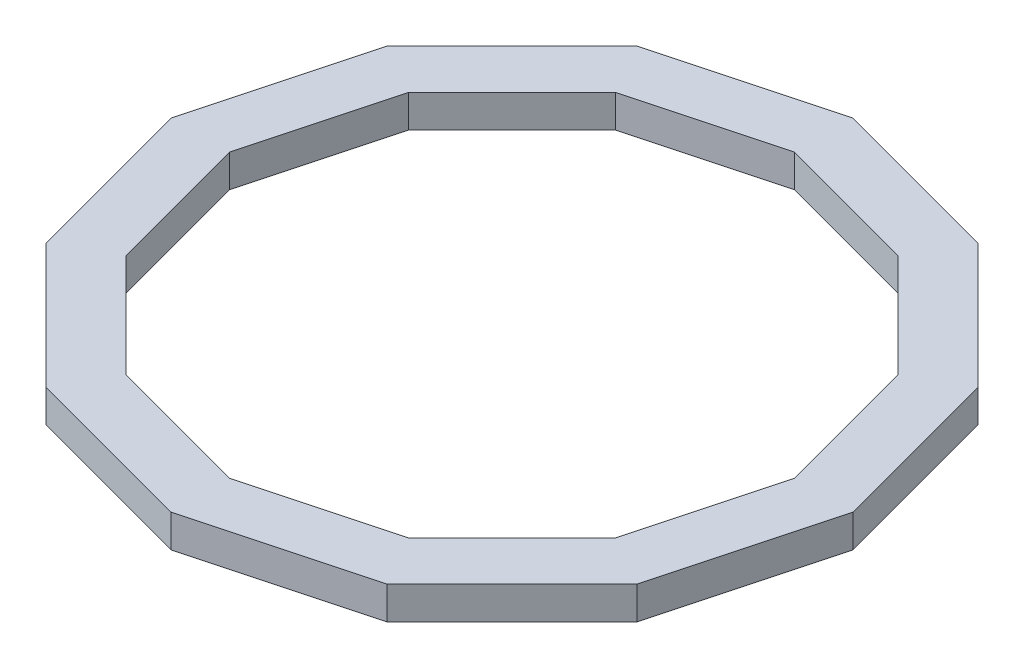
ISO-10303-21;
HEADER;
FILE_DESCRIPTION(('STEP AP214'),'2;1');
FILE_NAME('part.step','',(''),(''),'','','');
FILE_SCHEMA(('AUTOMOTIVE_DESIGN { 1 0 10303 214 1 1 1 1 }'));
ENDSEC;
DATA;
#1=APPLICATION_CONTEXT('core data for automotive mechanical design processes');
#2=APPLICATION_PROTOCOL_DEFINITION('international standard','automotive_design',2000,#1);
#3=PRODUCT_CONTEXT('',#1,'mechanical');
#4=PRODUCT('Part','Part','',(#3));
#5=PRODUCT_RELATED_PRODUCT_CATEGORY('part','',(#4));
#6=PRODUCT_DEFINITION_FORMATION('','',#4);
#7=PRODUCT_DEFINITION_CONTEXT('part definition',#1,'design');
#8=PRODUCT_DEFINITION('design','',#6,#7);
#9=PRODUCT_DEFINITION_SHAPE('','',#8);
#10=(LENGTH_UNIT() NAMED_UNIT(*) SI_UNIT(.MILLI.,.METRE.));
#11=(NAMED_UNIT(*) PLANE_ANGLE_UNIT() SI_UNIT($,.RADIAN.));
#12=(NAMED_UNIT(*) SI_UNIT($,.STERADIAN.) SOLID_ANGLE_UNIT());
#13=UNCERTAINTY_MEASURE_WITH_UNIT(LENGTH_MEASURE(1.E-05),#10,'distance_accuracy_value','');
#14=(GEOMETRIC_REPRESENTATION_CONTEXT(3) GLOBAL_UNCERTAINTY_ASSIGNED_CONTEXT((#13)) GLOBAL_UNIT_ASSIGNED_CONTEXT((#10,
#11,#12)) REPRESENTATION_CONTEXT('',''));
#15=CARTESIAN_POINT('',(0.,0.,0.));
#16=DIRECTION('',(0.,0.,1.));
#17=DIRECTION('',(1.,0.,0.));
#18=AXIS2_PLACEMENT_3D('',#15,#16,#17);
#19=CARTESIAN_POINT('',(0.,19.05,0.));
#20=DIRECTION('',(0.,1.,0.));
#21=DIRECTION('',(0.,0.,1.));
#22=AXIS2_PLACEMENT_3D('',#19,#20,#21);
#23=PLANE('',#22);
#24=DIRECTION('',(-0.258819045102499,0.,0.965925826289074));
#25=VECTOR('',#24,1.);
#26=CARTESIAN_POINT('',(-172.104864331019,19.05,-99.3647897503525));
#27=LINE('',#26,#25);
#28=CARTESIAN_POINT('',(-172.104864331019,19.05,-99.3647897503525));
#29=VERTEX_POINT('',#28);
#30=CARTESIAN_POINT('',(-198.729579500713,19.05,4.5102810375397E-12));
#31=VERTEX_POINT('',#30);
#32=EDGE_CURVE('E290',#29,#31,#27,.T.);
#33=ORIENTED_EDGE('',*,*,#32,.T.);
#34=DIRECTION('',(0.258819045102544,0.,0.965925826289062));
#35=VECTOR('',#34,1.);
#36=CARTESIAN_POINT('',(-198.729579500713,19.05,4.5102810375397E-12));
#37=LINE('',#36,#35);
#38=CARTESIAN_POINT('',(-172.104864331014,19.05,99.3647897503605));
#39=VERTEX_POINT('',#38);
#40=EDGE_CURVE('E293',#31,#39,#37,.T.);
#41=ORIENTED_EDGE('',*,*,#40,.T.);
#42=DIRECTION('',(0.707106781186564,0.,0.707106781186531));
#43=VECTOR('',#42,1.);
#44=CARTESIAN_POINT('',(-172.104864331014,19.05,99.3647897503605));
#45=LINE('',#44,#43);
#46=CARTESIAN_POINT('',(-99.3647897503525,19.05,172.104864331019));
#47=VERTEX_POINT('',#46);
#48=EDGE_CURVE('E296',#39,#47,#45,.T.);
#49=ORIENTED_EDGE('',*,*,#48,.T.);
#50=DIRECTION('',(0.965925826289074,0.,0.258819045102499));
#51=VECTOR('',#50,1.);
#52=CARTESIAN_POINT('',(-99.3647897503525,19.05,172.104864331019));
#53=LINE('',#52,#51);
#54=CARTESIAN_POINT('',(4.53704357598842E-12,19.05,198.729579500713));
#55=VERTEX_POINT('',#54);
#56=EDGE_CURVE('E298',#47,#55,#53,.T.);
#57=ORIENTED_EDGE('',*,*,#56,.T.);
#58=DIRECTION('',(0.965925826289062,0.,-0.258819045102543));
#59=VECTOR('',#58,1.);
#60=CARTESIAN_POINT('',(4.53704357598842E-12,19.05,198.729579500713));
#61=LINE('',#60,#59);
#62=CARTESIAN_POINT('',(99.3647897503604,19.05,172.104864331014));
#63=VERTEX_POINT('',#62);
#64=EDGE_CURVE('E300',#55,#63,#61,.T.);
#65=ORIENTED_EDGE('',*,*,#64,.T.);
#66=DIRECTION('',(0.707106781186531,0.,-0.707106781186564));
#67=VECTOR('',#66,1.);
#68=CARTESIAN_POINT('',(99.3647897503604,19.05,172.104864331014));
#69=LINE('',#68,#67);
#70=CARTESIAN_POINT('',(172.104864331019,19.05,99.3647897503524));
#71=VERTEX_POINT('',#70);
#72=EDGE_CURVE('E302',#63,#71,#69,.T.);
#73=ORIENTED_EDGE('',*,*,#72,.T.);
#74=DIRECTION('',(0.258819045102499,0.,-0.965925826289074));
#75=VECTOR('',#74,1.);
#76=CARTESIAN_POINT('',(172.104864331019,19.05,99.3647897503524));
#77=LINE('',#76,#75);
#78=CARTESIAN_POINT('',(198.729579500713,19.05,-4.60656869809146E-12));
#79=VERTEX_POINT('',#78);
#80=EDGE_CURVE('E304',#71,#79,#77,.T.);
#81=ORIENTED_EDGE('',*,*,#80,.T.);
#82=DIRECTION('',(-0.258819045102544,0.,-0.965925826289062));
#83=VECTOR('',#82,1.);
#84=CARTESIAN_POINT('',(198.729579500713,19.05,-4.60656869809146E-12));
#85=LINE('',#84,#83);
#86=CARTESIAN_POINT('',(172.104864331014,19.05,-99.3647897503603));
#87=VERTEX_POINT('',#86);
#88=EDGE_CURVE('E306',#79,#87,#85,.T.);
#89=ORIENTED_EDGE('',*,*,#88,.T.);
#90=DIRECTION('',(-0.707106781186564,0.,-0.707106781186531));
#91=VECTOR('',#90,1.);
#92=CARTESIAN_POINT('',(172.104864331014,19.05,-99.3647897503603));
#93=LINE('',#92,#91);
#94=CARTESIAN_POINT('',(99.3647897503522,19.05,-172.104864331019));
#95=VERTEX_POINT('',#94);
#96=EDGE_CURVE('E308',#87,#95,#93,.T.);
#97=ORIENTED_EDGE('',*,*,#96,.T.);
#98=DIRECTION('',(-0.965925826289074,0.,-0.2588190451025));
#99=VECTOR('',#98,1.);
#100=CARTESIAN_POINT('',(99.3647897503522,19.05,-172.104864331019));
#101=LINE('',#100,#99);
#102=CARTESIAN_POINT('',(-4.46864767411626E-12,19.05,-198.729579500713));
#103=VERTEX_POINT('',#102);
#104=EDGE_CURVE('E310',#95,#103,#101,.T.);
#105=ORIENTED_EDGE('',*,*,#104,.T.);
#106=DIRECTION('',(-0.965925826289062,0.,0.258819045102543));
#107=VECTOR('',#106,1.);
#108=CARTESIAN_POINT('',(-4.46864767411626E-12,19.05,-198.729579500713));
#109=LINE('',#108,#107);
#110=CARTESIAN_POINT('',(-99.3647897503603,19.05,-172.104864331014));
#111=VERTEX_POINT('',#110);
#112=EDGE_CURVE('E312',#103,#111,#109,.T.);
#113=ORIENTED_EDGE('',*,*,#112,.T.);
#114=DIRECTION('',(-0.707106781186532,0.,0.707106781186563));
#115=VECTOR('',#114,1.);
#116=CARTESIAN_POINT('',(-99.3647897503603,19.05,-172.104864331014));
#117=LINE('',#116,#115);
#118=EDGE_CURVE('E315',#111,#29,#117,.T.);
#119=ORIENTED_EDGE('',*,*,#118,.T.);
#120=EDGE_LOOP('',(#33,#41,#49,#57,#65,#73,#81,#89,#97,#105,#113,#119));
#121=FACE_BOUND('',#120,.T.);
#122=DIRECTION('',(0.258819045102545,0.,0.965925826289062));
#123=VECTOR('',#122,1.);
#124=CARTESIAN_POINT('',(-164.544760023572,19.05,3.70497493169164E-12));
#125=LINE('',#124,#123);
#126=CARTESIAN_POINT('',(-164.544760023572,19.05,3.70497493169164E-12));
#127=VERTEX_POINT('',#126);
#128=CARTESIAN_POINT('',(-142.499942240025,19.05,82.2723800117893));
#129=VERTEX_POINT('',#128);
#130=EDGE_CURVE('E204',#127,#129,#125,.T.);
#131=ORIENTED_EDGE('',*,*,#130,.F.);
#132=DIRECTION('',(-0.258819045102499,0.,0.965925826289074));
#133=VECTOR('',#132,1.);
#134=CARTESIAN_POINT('',(-142.499942240029,19.05,-82.2723800117825));
#135=LINE('',#134,#133);
#136=CARTESIAN_POINT('',(-142.499942240029,19.05,-82.2723800117825));
#137=VERTEX_POINT('',#136);
#138=EDGE_CURVE('E196',#137,#127,#135,.T.);
#139=ORIENTED_EDGE('',*,*,#138,.F.);
#140=DIRECTION('',(-0.707106781186531,0.,0.707106781186564));
#141=VECTOR('',#140,1.);
#142=CARTESIAN_POINT('',(-82.2723800117893,19.05,-142.499942240025));
#143=LINE('',#142,#141);
#144=CARTESIAN_POINT('',(-82.2723800117893,19.05,-142.499942240025));
#145=VERTEX_POINT('',#144);
#146=EDGE_CURVE('E237',#145,#137,#143,.T.);
#147=ORIENTED_EDGE('',*,*,#146,.F.);
#148=DIRECTION('',(-0.965925826289062,0.,0.258819045102545));
#149=VECTOR('',#148,1.);
#150=CARTESIAN_POINT('',(-3.82932602369831E-12,19.05,-164.544760023572));
#151=LINE('',#150,#149);
#152=CARTESIAN_POINT('',(-3.82932602369831E-12,19.05,-164.544760023572));
#153=VERTEX_POINT('',#152);
#154=EDGE_CURVE('E235',#153,#145,#151,.T.);
#155=ORIENTED_EDGE('',*,*,#154,.F.);
#156=DIRECTION('',(-0.965925826289074,0.,-0.258819045102499));
#157=VECTOR('',#156,1.);
#158=CARTESIAN_POINT('',(82.2723800117824,19.05,-142.499942240029));
#159=LINE('',#158,#157);
#160=CARTESIAN_POINT('',(82.2723800117824,19.05,-142.499942240029));
#161=VERTEX_POINT('',#160);
#162=EDGE_CURVE('E233',#161,#153,#159,.T.);
#163=ORIENTED_EDGE('',*,*,#162,.F.);
#164=DIRECTION('',(-0.707106781186564,0.,-0.707106781186531));
#165=VECTOR('',#164,1.);
#166=CARTESIAN_POINT('',(142.499942240025,19.05,-82.2723800117893));
#167=LINE('',#166,#165);
#168=CARTESIAN_POINT('',(142.499942240025,19.05,-82.2723800117893));
#169=VERTEX_POINT('',#168);
#170=EDGE_CURVE('E231',#169,#161,#167,.T.);
#171=ORIENTED_EDGE('',*,*,#170,.F.);
#172=DIRECTION('',(-0.258819045102545,0.,-0.965925826289062));
#173=VECTOR('',#172,1.);
#174=CARTESIAN_POINT('',(164.544760023572,19.05,-3.77316045184108E-12));
#175=LINE('',#174,#173);
#176=CARTESIAN_POINT('',(164.544760023572,19.05,-3.77316045184108E-12));
#177=VERTEX_POINT('',#176);
#178=EDGE_CURVE('E229',#177,#169,#175,.T.);
#179=ORIENTED_EDGE('',*,*,#178,.F.);
#180=DIRECTION('',(0.258819045102499,0.,-0.965925826289074));
#181=VECTOR('',#180,1.);
#182=CARTESIAN_POINT('',(142.499942240029,19.05,82.2723800117825));
#183=LINE('',#182,#181);
#184=CARTESIAN_POINT('',(142.499942240029,19.05,82.2723800117825));
#185=VERTEX_POINT('',#184);
#186=EDGE_CURVE('E227',#185,#177,#183,.T.);
#187=ORIENTED_EDGE('',*,*,#186,.F.);
#188=DIRECTION('',(0.707106781186531,0.,-0.707106781186565));
#189=VECTOR('',#188,1.);
#190=CARTESIAN_POINT('',(82.2723800117894,19.05,142.499942240025));
#191=LINE('',#190,#189);
#192=CARTESIAN_POINT('',(82.2723800117894,19.05,142.499942240025));
#193=VERTEX_POINT('',#192);
#194=EDGE_CURVE('E225',#193,#185,#191,.T.);
#195=ORIENTED_EDGE('',*,*,#194,.F.);
#196=DIRECTION('',(0.965925826289062,0.,-0.258819045102545));
#197=VECTOR('',#196,1.);
#198=CARTESIAN_POINT('',(3.8234449709172E-12,19.05,164.544760023572));
#199=LINE('',#198,#197);
#200=CARTESIAN_POINT('',(3.8234449709172E-12,19.05,164.544760023572));
#201=VERTEX_POINT('',#200);
#202=EDGE_CURVE('E223',#201,#193,#199,.T.);
#203=ORIENTED_EDGE('',*,*,#202,.F.);
#204=DIRECTION('',(0.965925826289074,0.,0.258819045102499));
#205=VECTOR('',#204,1.);
#206=CARTESIAN_POINT('',(-82.2723800117824,19.05,142.499942240029));
#207=LINE('',#206,#205);
#208=CARTESIAN_POINT('',(-82.2723800117824,19.05,142.499942240029));
#209=VERTEX_POINT('',#208);
#210=EDGE_CURVE('E219',#209,#201,#207,.T.);
#211=ORIENTED_EDGE('',*,*,#210,.F.);
#212=DIRECTION('',(0.707106781186565,0.,0.70710678118653));
#213=VECTOR('',#212,1.);
#214=CARTESIAN_POINT('',(-142.499942240025,19.05,82.2723800117893));
#215=LINE('',#214,#213);
#216=EDGE_CURVE('E217',#129,#209,#215,.T.);
#217=ORIENTED_EDGE('',*,*,#216,.F.);
#218=EDGE_LOOP('',(#131,#139,#147,#155,#163,#171,#179,#187,#195,#203,#211,#217));
#219=FACE_BOUND('',#218,.T.);
#220=ADVANCED_FACE('F35',(#121,#219),#23,.T.);
#221=CARTESIAN_POINT('',(0.,0.,0.));
#222=DIRECTION('',(0.,1.,0.));
#223=DIRECTION('',(0.,0.,1.));
#224=AXIS2_PLACEMENT_3D('',#221,#222,#223);
#225=PLANE('',#224);
#226=DIRECTION('',(-0.258819045102499,0.,0.965925826289074));
#227=VECTOR('',#226,1.);
#228=CARTESIAN_POINT('',(-172.104864331019,0.,-99.3647897503525));
#229=LINE('',#228,#227);
#230=CARTESIAN_POINT('',(-172.104864331019,0.,-99.3647897503525));
#231=VERTEX_POINT('',#230);
#232=CARTESIAN_POINT('',(-198.729579500713,0.,4.5102810375397E-12));
#233=VERTEX_POINT('',#232);
#234=EDGE_CURVE('E212',#231,#233,#229,.T.);
#235=ORIENTED_EDGE('',*,*,#234,.F.);
#236=DIRECTION('',(-0.707106781186532,0.,0.707106781186563));
#237=VECTOR('',#236,1.);
#238=CARTESIAN_POINT('',(-99.3647897503603,0.,-172.104864331014));
#239=LINE('',#238,#237);
#240=CARTESIAN_POINT('',(-99.3647897503603,0.,-172.104864331014));
#241=VERTEX_POINT('',#240);
#242=EDGE_CURVE('E294',#241,#231,#239,.T.);
#243=ORIENTED_EDGE('',*,*,#242,.F.);
#244=DIRECTION('',(-0.965925826289062,0.,0.258819045102543));
#245=VECTOR('',#244,1.);
#246=CARTESIAN_POINT('',(-4.46864767411626E-12,0.,-198.729579500713));
#247=LINE('',#246,#245);
#248=CARTESIAN_POINT('',(-4.46864767411626E-12,0.,-198.729579500713));
#249=VERTEX_POINT('',#248);
#250=EDGE_CURVE('E338',#249,#241,#247,.T.);
#251=ORIENTED_EDGE('',*,*,#250,.F.);
#252=DIRECTION('',(-0.965925826289074,0.,-0.2588190451025));
#253=VECTOR('',#252,1.);
#254=CARTESIAN_POINT('',(99.3647897503522,0.,-172.104864331019));
#255=LINE('',#254,#253);
#256=CARTESIAN_POINT('',(99.3647897503522,0.,-172.104864331019));
#257=VERTEX_POINT('',#256);
#258=EDGE_CURVE('E336',#257,#249,#255,.T.);
#259=ORIENTED_EDGE('',*,*,#258,.F.);
#260=DIRECTION('',(-0.707106781186564,0.,-0.707106781186531));
#261=VECTOR('',#260,1.);
#262=CARTESIAN_POINT('',(172.104864331014,0.,-99.3647897503603));
#263=LINE('',#262,#261);
#264=CARTESIAN_POINT('',(172.104864331014,0.,-99.3647897503603));
#265=VERTEX_POINT('',#264);
#266=EDGE_CURVE('E334',#265,#257,#263,.T.);
#267=ORIENTED_EDGE('',*,*,#266,.F.);
#268=DIRECTION('',(-0.258819045102544,0.,-0.965925826289062));
#269=VECTOR('',#268,1.);
#270=CARTESIAN_POINT('',(198.729579500713,0.,-4.60656869809146E-12));
#271=LINE('',#270,#269);
#272=CARTESIAN_POINT('',(198.729579500713,0.,-4.60656869809146E-12));
#273=VERTEX_POINT('',#272);
#274=EDGE_CURVE('E332',#273,#265,#271,.T.);
#275=ORIENTED_EDGE('',*,*,#274,.F.);
#276=DIRECTION('',(0.258819045102499,0.,-0.965925826289074));
#277=VECTOR('',#276,1.);
#278=CARTESIAN_POINT('',(172.104864331019,0.,99.3647897503524));
#279=LINE('',#278,#277);
#280=CARTESIAN_POINT('',(172.104864331019,0.,99.3647897503524));
#281=VERTEX_POINT('',#280);
#282=EDGE_CURVE('E330',#281,#273,#279,.T.);
#283=ORIENTED_EDGE('',*,*,#282,.F.);
#284=DIRECTION('',(0.707106781186531,0.,-0.707106781186564));
#285=VECTOR('',#284,1.);
#286=CARTESIAN_POINT('',(99.3647897503604,0.,172.104864331014));
#287=LINE('',#286,#285);
#288=CARTESIAN_POINT('',(99.3647897503604,0.,172.104864331014));
#289=VERTEX_POINT('',#288);
#290=EDGE_CURVE('E328',#289,#281,#287,.T.);
#291=ORIENTED_EDGE('',*,*,#290,.F.);
#292=DIRECTION('',(0.965925826289062,0.,-0.258819045102543));
#293=VECTOR('',#292,1.);
#294=CARTESIAN_POINT('',(4.53704357598842E-12,0.,198.729579500713));
#295=LINE('',#294,#293);
#296=CARTESIAN_POINT('',(4.53704357598842E-12,0.,198.729579500713));
#297=VERTEX_POINT('',#296);
#298=EDGE_CURVE('E326',#297,#289,#295,.T.);
#299=ORIENTED_EDGE('',*,*,#298,.F.);
#300=DIRECTION('',(0.965925826289074,0.,0.258819045102499));
#301=VECTOR('',#300,1.);
#302=CARTESIAN_POINT('',(-99.3647897503525,0.,172.104864331019));
#303=LINE('',#302,#301);
#304=CARTESIAN_POINT('',(-99.3647897503525,0.,172.104864331019));
#305=VERTEX_POINT('',#304);
#306=EDGE_CURVE('E324',#305,#297,#303,.T.);
#307=ORIENTED_EDGE('',*,*,#306,.F.);
#308=DIRECTION('',(0.707106781186564,0.,0.707106781186531));
#309=VECTOR('',#308,1.);
#310=CARTESIAN_POINT('',(-172.104864331014,0.,99.3647897503605));
#311=LINE('',#310,#309);
#312=CARTESIAN_POINT('',(-172.104864331014,0.,99.3647897503605));
#313=VERTEX_POINT('',#312);
#314=EDGE_CURVE('E322',#313,#305,#311,.T.);
#315=ORIENTED_EDGE('',*,*,#314,.F.);
#316=DIRECTION('',(0.258819045102544,0.,0.965925826289062));
#317=VECTOR('',#316,1.);
#318=CARTESIAN_POINT('',(-198.729579500713,0.,4.5102810375397E-12));
#319=LINE('',#318,#317);
#320=EDGE_CURVE('E320',#233,#313,#319,.T.);
#321=ORIENTED_EDGE('',*,*,#320,.F.);
#322=EDGE_LOOP('',(#235,#243,#251,#259,#267,#275,#283,#291,#299,#307,#315,#321));
#323=FACE_BOUND('',#322,.T.);
#324=DIRECTION('',(-0.258819045102499,0.,0.965925826289074));
#325=VECTOR('',#324,1.);
#326=CARTESIAN_POINT('',(-142.499942240029,0.,-82.2723800117825));
#327=LINE('',#326,#325);
#328=CARTESIAN_POINT('',(-142.499942240029,0.,-82.2723800117825));
#329=VERTEX_POINT('',#328);
#330=CARTESIAN_POINT('',(-164.544760023572,0.,3.70497493169164E-12));
#331=VERTEX_POINT('',#330);
#332=EDGE_CURVE('E58',#329,#331,#327,.T.);
#333=ORIENTED_EDGE('',*,*,#332,.T.);
#334=DIRECTION('',(0.258819045102545,0.,0.965925826289062));
#335=VECTOR('',#334,1.);
#336=CARTESIAN_POINT('',(-164.544760023572,0.,3.70497493169164E-12));
#337=LINE('',#336,#335);
#338=CARTESIAN_POINT('',(-142.499942240025,0.,82.2723800117893));
#339=VERTEX_POINT('',#338);
#340=EDGE_CURVE('E211',#331,#339,#337,.T.);
#341=ORIENTED_EDGE('',*,*,#340,.T.);
#342=DIRECTION('',(0.707106781186565,0.,0.70710678118653));
#343=VECTOR('',#342,1.);
#344=CARTESIAN_POINT('',(-142.499942240025,0.,82.2723800117893));
#345=LINE('',#344,#343);
#346=CARTESIAN_POINT('',(-82.2723800117824,0.,142.499942240029));
#347=VERTEX_POINT('',#346);
#348=EDGE_CURVE('E241',#339,#347,#345,.T.);
#349=ORIENTED_EDGE('',*,*,#348,.T.);
#350=DIRECTION('',(0.965925826289074,0.,0.258819045102499));
#351=VECTOR('',#350,1.);
#352=CARTESIAN_POINT('',(-82.2723800117824,0.,142.499942240029));
#353=LINE('',#352,#351);
#354=CARTESIAN_POINT('',(3.8234449709172E-12,0.,164.544760023572));
#355=VERTEX_POINT('',#354);
#356=EDGE_CURVE('E244',#347,#355,#353,.T.);
#357=ORIENTED_EDGE('',*,*,#356,.T.);
#358=DIRECTION('',(0.965925826289062,0.,-0.258819045102545));
#359=VECTOR('',#358,1.);
#360=CARTESIAN_POINT('',(3.8234449709172E-12,0.,164.544760023572));
#361=LINE('',#360,#359);
#362=CARTESIAN_POINT('',(82.2723800117894,0.,142.499942240025));
#363=VERTEX_POINT('',#362);
#364=EDGE_CURVE('E247',#355,#363,#361,.T.);
#365=ORIENTED_EDGE('',*,*,#364,.T.);
#366=DIRECTION('',(0.707106781186531,0.,-0.707106781186565));
#367=VECTOR('',#366,1.);
#368=CARTESIAN_POINT('',(82.2723800117894,0.,142.499942240025));
#369=LINE('',#368,#367);
#370=CARTESIAN_POINT('',(142.499942240029,0.,82.2723800117825));
#371=VERTEX_POINT('',#370);
#372=EDGE_CURVE('E250',#363,#371,#369,.T.);
#373=ORIENTED_EDGE('',*,*,#372,.T.);
#374=DIRECTION('',(0.258819045102499,0.,-0.965925826289074));
#375=VECTOR('',#374,1.);
#376=CARTESIAN_POINT('',(142.499942240029,0.,82.2723800117825));
#377=LINE('',#376,#375);
#378=CARTESIAN_POINT('',(164.544760023572,0.,-3.77316045184108E-12));
#379=VERTEX_POINT('',#378);
#380=EDGE_CURVE('E253',#371,#379,#377,.T.);
#381=ORIENTED_EDGE('',*,*,#380,.T.);
#382=DIRECTION('',(-0.258819045102545,0.,-0.965925826289062));
#383=VECTOR('',#382,1.);
#384=CARTESIAN_POINT('',(164.544760023572,0.,-3.77316045184108E-12));
#385=LINE('',#384,#383);
#386=CARTESIAN_POINT('',(142.499942240025,0.,-82.2723800117893));
#387=VERTEX_POINT('',#386);
#388=EDGE_CURVE('E256',#379,#387,#385,.T.);
#389=ORIENTED_EDGE('',*,*,#388,.T.);
#390=DIRECTION('',(-0.707106781186564,0.,-0.707106781186531));
#391=VECTOR('',#390,1.);
#392=CARTESIAN_POINT('',(142.499942240025,0.,-82.2723800117893));
#393=LINE('',#392,#391);
#394=CARTESIAN_POINT('',(82.2723800117824,0.,-142.499942240029));
#395=VERTEX_POINT('',#394);
#396=EDGE_CURVE('E259',#387,#395,#393,.T.);
#397=ORIENTED_EDGE('',*,*,#396,.T.);
#398=DIRECTION('',(-0.965925826289074,0.,-0.258819045102499));
#399=VECTOR('',#398,1.);
#400=CARTESIAN_POINT('',(82.2723800117824,0.,-142.499942240029));
#401=LINE('',#400,#399);
#402=CARTESIAN_POINT('',(-3.82932602369831E-12,0.,-164.544760023572));
#403=VERTEX_POINT('',#402);
#404=EDGE_CURVE('E262',#395,#403,#401,.T.);
#405=ORIENTED_EDGE('',*,*,#404,.T.);
#406=DIRECTION('',(-0.965925826289062,0.,0.258819045102545));
#407=VECTOR('',#406,1.);
#408=CARTESIAN_POINT('',(-3.82932602369831E-12,0.,-164.544760023572));
#409=LINE('',#408,#407);
#410=CARTESIAN_POINT('',(-82.2723800117893,0.,-142.499942240025));
#411=VERTEX_POINT('',#410);
#412=EDGE_CURVE('E265',#403,#411,#409,.T.);
#413=ORIENTED_EDGE('',*,*,#412,.T.);
#414=DIRECTION('',(-0.707106781186531,0.,0.707106781186564));
#415=VECTOR('',#414,1.);
#416=CARTESIAN_POINT('',(-82.2723800117893,0.,-142.499942240025));
#417=LINE('',#416,#415);
#418=EDGE_CURVE('E205',#411,#329,#417,.T.);
#419=ORIENTED_EDGE('',*,*,#418,.T.);
#420=EDGE_LOOP('',(#333,#341,#349,#357,#365,#373,#381,#389,#397,#405,#413,#419));
#421=FACE_BOUND('',#420,.T.);
#422=ADVANCED_FACE('F381',(#323,#421),#225,.F.);
#423=CARTESIAN_POINT('',(-172.104864331019,19.05,-99.3647897503525));
#424=DIRECTION('',(0.965925826289074,0.,0.258819045102499));
#425=DIRECTION('',(0.258819045102499,0.,-0.965925826289074));
#426=AXIS2_PLACEMENT_3D('',#423,#424,#425);
#427=PLANE('',#426);
#428=ORIENTED_EDGE('',*,*,#234,.T.);
#429=DIRECTION('',(0.,-1.,0.));
#430=VECTOR('',#429,1.);
#431=CARTESIAN_POINT('',(-198.729579500713,19.05,4.5102810375397E-12));
#432=LINE('',#431,#430);
#433=EDGE_CURVE('E11',#31,#233,#432,.T.);
#434=ORIENTED_EDGE('',*,*,#433,.F.);
#435=ORIENTED_EDGE('',*,*,#32,.F.);
#436=DIRECTION('',(0.,-1.,0.));
#437=VECTOR('',#436,1.);
#438=CARTESIAN_POINT('',(-172.104864331019,19.05,-99.3647897503525));
#439=LINE('',#438,#437);
#440=EDGE_CURVE('E317',#29,#231,#439,.T.);
#441=ORIENTED_EDGE('',*,*,#440,.T.);
#442=EDGE_LOOP('',(#428,#434,#435,#441));
#443=FACE_BOUND('',#442,.T.);
#444=ADVANCED_FACE('F37',(#443),#427,.F.);
#445=CARTESIAN_POINT('',(-198.729579500713,19.05,4.5102810375397E-12));
#446=DIRECTION('',(0.965925826289062,0.,-0.258819045102544));
#447=DIRECTION('',(-0.258819045102544,0.,-0.965925826289062));
#448=AXIS2_PLACEMENT_3D('',#445,#446,#447);
#449=PLANE('',#448);
#450=ORIENTED_EDGE('',*,*,#320,.T.);
#451=DIRECTION('',(0.,-1.,0.));
#452=VECTOR('',#451,1.);
#453=CARTESIAN_POINT('',(-172.104864331014,19.05,99.3647897503605));
#454=LINE('',#453,#452);
#455=EDGE_CURVE('E43',#39,#313,#454,.T.);
#456=ORIENTED_EDGE('',*,*,#455,.F.);
#457=ORIENTED_EDGE('',*,*,#40,.F.);
#458=ORIENTED_EDGE('',*,*,#433,.T.);
#459=EDGE_LOOP('',(#450,#456,#457,#458));
#460=FACE_BOUND('',#459,.T.);
#461=ADVANCED_FACE('F398',(#460),#449,.F.);
#462=CARTESIAN_POINT('',(-172.104864331014,19.05,99.3647897503605));
#463=DIRECTION('',(0.707106781186531,0.,-0.707106781186564));
#464=DIRECTION('',(-0.707106781186564,0.,-0.707106781186531));
#465=AXIS2_PLACEMENT_3D('',#462,#463,#464);
#466=PLANE('',#465);
#467=ORIENTED_EDGE('',*,*,#314,.T.);
#468=DIRECTION('',(0.,-1.,0.));
#469=VECTOR('',#468,1.);
#470=CARTESIAN_POINT('',(-99.3647897503525,19.05,172.104864331019));
#471=LINE('',#470,#469);
#472=EDGE_CURVE('E368',#47,#305,#471,.T.);
#473=ORIENTED_EDGE('',*,*,#472,.F.);
#474=ORIENTED_EDGE('',*,*,#48,.F.);
#475=ORIENTED_EDGE('',*,*,#455,.T.);
#476=EDGE_LOOP('',(#467,#473,#474,#475));
#477=FACE_BOUND('',#476,.T.);
#478=ADVANCED_FACE('F375',(#477),#466,.F.);
#479=CARTESIAN_POINT('',(-99.3647897503525,19.05,172.104864331019));
#480=DIRECTION('',(0.258819045102499,0.,-0.965925826289074));
#481=DIRECTION('',(-0.965925826289074,0.,-0.258819045102499));
#482=AXIS2_PLACEMENT_3D('',#479,#480,#481);
#483=PLANE('',#482);
#484=ORIENTED_EDGE('',*,*,#306,.T.);
#485=DIRECTION('',(0.,-1.,0.));
#486=VECTOR('',#485,1.);
#487=CARTESIAN_POINT('',(4.53704357598842E-12,19.05,198.729579500713));
#488=LINE('',#487,#486);
#489=EDGE_CURVE('E365',#55,#297,#488,.T.);
#490=ORIENTED_EDGE('',*,*,#489,.F.);
#491=ORIENTED_EDGE('',*,*,#56,.F.);
#492=ORIENTED_EDGE('',*,*,#472,.T.);
#493=EDGE_LOOP('',(#484,#490,#491,#492));
#494=FACE_BOUND('',#493,.T.);
#495=ADVANCED_FACE('F387',(#494),#483,.F.);
#496=CARTESIAN_POINT('',(4.53704357598842E-12,19.05,198.729579500713));
#497=DIRECTION('',(-0.258819045102543,0.,-0.965925826289062));
#498=DIRECTION('',(-0.965925826289062,0.,0.258819045102543));
#499=AXIS2_PLACEMENT_3D('',#496,#497,#498);
#500=PLANE('',#499);
#501=ORIENTED_EDGE('',*,*,#298,.T.);
#502=DIRECTION('',(0.,-1.,0.));
#503=VECTOR('',#502,1.);
#504=CARTESIAN_POINT('',(99.3647897503604,19.05,172.104864331014));
#505=LINE('',#504,#503);
#506=EDGE_CURVE('E362',#63,#289,#505,.T.);
#507=ORIENTED_EDGE('',*,*,#506,.F.);
#508=ORIENTED_EDGE('',*,*,#64,.F.);
#509=ORIENTED_EDGE('',*,*,#489,.T.);
#510=EDGE_LOOP('',(#501,#507,#508,#509));
#511=FACE_BOUND('',#510,.T.);
#512=ADVANCED_FACE('F391',(#511),#500,.F.);
#513=CARTESIAN_POINT('',(99.3647897503604,19.05,172.104864331014));
#514=DIRECTION('',(-0.707106781186564,0.,-0.707106781186531));
#515=DIRECTION('',(-0.707106781186531,0.,0.707106781186564));
#516=AXIS2_PLACEMENT_3D('',#513,#514,#515);
#517=PLANE('',#516);
#518=ORIENTED_EDGE('',*,*,#290,.T.);
#519=DIRECTION('',(0.,-1.,0.));
#520=VECTOR('',#519,1.);
#521=CARTESIAN_POINT('',(172.104864331019,19.05,99.3647897503524));
#522=LINE('',#521,#520);
#523=EDGE_CURVE('E359',#71,#281,#522,.T.);
#524=ORIENTED_EDGE('',*,*,#523,.F.);
#525=ORIENTED_EDGE('',*,*,#72,.F.);
#526=ORIENTED_EDGE('',*,*,#506,.T.);
#527=EDGE_LOOP('',(#518,#524,#525,#526));
#528=FACE_BOUND('',#527,.T.);
#529=ADVANCED_FACE('F431',(#528),#517,.F.);
#530=CARTESIAN_POINT('',(172.104864331019,19.05,99.3647897503524));
#531=DIRECTION('',(-0.965925826289074,0.,-0.258819045102499));
#532=DIRECTION('',(-0.258819045102499,0.,0.965925826289074));
#533=AXIS2_PLACEMENT_3D('',#530,#531,#532);
#534=PLANE('',#533);
#535=ORIENTED_EDGE('',*,*,#282,.T.);
#536=DIRECTION('',(0.,-1.,0.));
#537=VECTOR('',#536,1.);
#538=CARTESIAN_POINT('',(198.729579500713,19.05,-4.60656869809146E-12));
#539=LINE('',#538,#537);
#540=EDGE_CURVE('E356',#79,#273,#539,.T.);
#541=ORIENTED_EDGE('',*,*,#540,.F.);
#542=ORIENTED_EDGE('',*,*,#80,.F.);
#543=ORIENTED_EDGE('',*,*,#523,.T.);
#544=EDGE_LOOP('',(#535,#541,#542,#543));
#545=FACE_BOUND('',#544,.T.);
#546=ADVANCED_FACE('F429',(#545),#534,.F.);
#547=CARTESIAN_POINT('',(198.729579500713,19.05,-4.60656869809146E-12));
#548=DIRECTION('',(-0.965925826289062,0.,0.258819045102544));
#549=DIRECTION('',(0.258819045102544,0.,0.965925826289062));
#550=AXIS2_PLACEMENT_3D('',#547,#548,#549);
#551=PLANE('',#550);
#552=ORIENTED_EDGE('',*,*,#274,.T.);
#553=DIRECTION('',(0.,-1.,0.));
#554=VECTOR('',#553,1.);
#555=CARTESIAN_POINT('',(172.104864331014,19.05,-99.3647897503603));
#556=LINE('',#555,#554);
#557=EDGE_CURVE('E353',#87,#265,#556,.T.);
#558=ORIENTED_EDGE('',*,*,#557,.F.);
#559=ORIENTED_EDGE('',*,*,#88,.F.);
#560=ORIENTED_EDGE('',*,*,#540,.T.);
#561=EDGE_LOOP('',(#552,#558,#559,#560));
#562=FACE_BOUND('',#561,.T.);
#563=ADVANCED_FACE('F425',(#562),#551,.F.);
#564=CARTESIAN_POINT('',(172.104864331014,19.05,-99.3647897503603));
#565=DIRECTION('',(-0.707106781186531,0.,0.707106781186564));
#566=DIRECTION('',(0.707106781186564,0.,0.707106781186531));
#567=AXIS2_PLACEMENT_3D('',#564,#565,#566);
#568=PLANE('',#567);
#569=ORIENTED_EDGE('',*,*,#266,.T.);
#570=DIRECTION('',(0.,-1.,0.));
#571=VECTOR('',#570,1.);
#572=CARTESIAN_POINT('',(99.3647897503522,19.05,-172.104864331019));
#573=LINE('',#572,#571);
#574=EDGE_CURVE('E350',#95,#257,#573,.T.);
#575=ORIENTED_EDGE('',*,*,#574,.F.);
#576=ORIENTED_EDGE('',*,*,#96,.F.);
#577=ORIENTED_EDGE('',*,*,#557,.T.);
#578=EDGE_LOOP('',(#569,#575,#576,#577));
#579=FACE_BOUND('',#578,.T.);
#580=ADVANCED_FACE('F420',(#579),#568,.F.);
#581=CARTESIAN_POINT('',(99.3647897503522,19.05,-172.104864331019));
#582=DIRECTION('',(-0.2588190451025,0.,0.965925826289074));
#583=DIRECTION('',(0.965925826289074,0.,0.2588190451025));
#584=AXIS2_PLACEMENT_3D('',#581,#582,#583);
#585=PLANE('',#584);
#586=ORIENTED_EDGE('',*,*,#258,.T.);
#587=DIRECTION('',(0.,-1.,0.));
#588=VECTOR('',#587,1.);
#589=CARTESIAN_POINT('',(-4.46864767411626E-12,19.05,-198.729579500713));
#590=LINE('',#589,#588);
#591=EDGE_CURVE('E347',#103,#249,#590,.T.);
#592=ORIENTED_EDGE('',*,*,#591,.F.);
#593=ORIENTED_EDGE('',*,*,#104,.F.);
#594=ORIENTED_EDGE('',*,*,#574,.T.);
#595=EDGE_LOOP('',(#586,#592,#593,#594));
#596=FACE_BOUND('',#595,.T.);
#597=ADVANCED_FACE('F414',(#596),#585,.F.);
#598=CARTESIAN_POINT('',(-4.46864767411626E-12,19.05,-198.729579500713));
#599=DIRECTION('',(0.258819045102543,0.,0.965925826289062));
#600=DIRECTION('',(0.965925826289062,0.,-0.258819045102543));
#601=AXIS2_PLACEMENT_3D('',#598,#599,#600);
#602=PLANE('',#601);
#603=ORIENTED_EDGE('',*,*,#250,.T.);
#604=DIRECTION('',(0.,-1.,0.));
#605=VECTOR('',#604,1.);
#606=CARTESIAN_POINT('',(-99.3647897503603,19.05,-172.104864331014));
#607=LINE('',#606,#605);
#608=EDGE_CURVE('E344',#111,#241,#607,.T.);
#609=ORIENTED_EDGE('',*,*,#608,.F.);
#610=ORIENTED_EDGE('',*,*,#112,.F.);
#611=ORIENTED_EDGE('',*,*,#591,.T.);
#612=EDGE_LOOP('',(#603,#609,#610,#611));
#613=FACE_BOUND('',#612,.T.);
#614=ADVANCED_FACE('F410',(#613),#602,.F.);
#615=CARTESIAN_POINT('',(-99.3647897503603,19.05,-172.104864331014));
#616=DIRECTION('',(0.707106781186563,0.,0.707106781186532));
#617=DIRECTION('',(0.707106781186532,0.,-0.707106781186563));
#618=AXIS2_PLACEMENT_3D('',#615,#616,#617);
#619=PLANE('',#618);
#620=ORIENTED_EDGE('',*,*,#242,.T.);
#621=ORIENTED_EDGE('',*,*,#440,.F.);
#622=ORIENTED_EDGE('',*,*,#118,.F.);
#623=ORIENTED_EDGE('',*,*,#608,.T.);
#624=EDGE_LOOP('',(#620,#621,#622,#623));
#625=FACE_BOUND('',#624,.T.);
#626=ADVANCED_FACE('F405',(#625),#619,.F.);
#627=CARTESIAN_POINT('',(-142.499942240029,19.05,-82.2723800117825));
#628=DIRECTION('',(0.965925826289074,0.,0.258819045102499));
#629=DIRECTION('',(0.258819045102499,0.,-0.965925826289074));
#630=AXIS2_PLACEMENT_3D('',#627,#628,#629);
#631=PLANE('',#630);
#632=ORIENTED_EDGE('',*,*,#332,.F.);
#633=DIRECTION('',(0.,-1.,0.));
#634=VECTOR('',#633,1.);
#635=CARTESIAN_POINT('',(-142.499942240029,19.05,-82.2723800117825));
#636=LINE('',#635,#634);
#637=EDGE_CURVE('E200',#137,#329,#636,.T.);
#638=ORIENTED_EDGE('',*,*,#637,.F.);
#639=ORIENTED_EDGE('',*,*,#138,.T.);
#640=DIRECTION('',(0.,-1.,0.));
#641=VECTOR('',#640,1.);
#642=CARTESIAN_POINT('',(-164.544760023572,19.05,3.70497493169164E-12));
#643=LINE('',#642,#641);
#644=EDGE_CURVE('E199',#127,#331,#643,.T.);
#645=ORIENTED_EDGE('',*,*,#644,.T.);
#646=EDGE_LOOP('',(#632,#638,#639,#645));
#647=FACE_BOUND('',#646,.T.);
#648=ADVANCED_FACE('F198',(#647),#631,.T.);
#649=CARTESIAN_POINT('',(-164.544760023572,19.05,3.70497493169164E-12));
#650=DIRECTION('',(0.965925826289062,0.,-0.258819045102545));
#651=DIRECTION('',(-0.258819045102545,0.,-0.965925826289062));
#652=AXIS2_PLACEMENT_3D('',#649,#650,#651);
#653=PLANE('',#652);
#654=ORIENTED_EDGE('',*,*,#340,.F.);
#655=ORIENTED_EDGE('',*,*,#644,.F.);
#656=ORIENTED_EDGE('',*,*,#130,.T.);
#657=DIRECTION('',(0.,-1.,0.));
#658=VECTOR('',#657,1.);
#659=CARTESIAN_POINT('',(-142.499942240025,19.05,82.2723800117893));
#660=LINE('',#659,#658);
#661=EDGE_CURVE('E213',#129,#339,#660,.T.);
#662=ORIENTED_EDGE('',*,*,#661,.T.);
#663=EDGE_LOOP('',(#654,#655,#656,#662));
#664=FACE_BOUND('',#663,.T.);
#665=ADVANCED_FACE('F208',(#664),#653,.T.);
#666=CARTESIAN_POINT('',(-142.499942240025,19.05,82.2723800117893));
#667=DIRECTION('',(0.707106781186531,0.,-0.707106781186565));
#668=DIRECTION('',(-0.707106781186565,0.,-0.707106781186531));
#669=AXIS2_PLACEMENT_3D('',#666,#667,#668);
#670=PLANE('',#669);
#671=ORIENTED_EDGE('',*,*,#348,.F.);
#672=ORIENTED_EDGE('',*,*,#661,.F.);
#673=ORIENTED_EDGE('',*,*,#216,.T.);
#674=DIRECTION('',(0.,-1.,0.));
#675=VECTOR('',#674,1.);
#676=CARTESIAN_POINT('',(-82.2723800117824,19.05,142.499942240029));
#677=LINE('',#676,#675);
#678=EDGE_CURVE('E287',#209,#347,#677,.T.);
#679=ORIENTED_EDGE('',*,*,#678,.T.);
#680=EDGE_LOOP('',(#671,#672,#673,#679));
#681=FACE_BOUND('',#680,.T.);
#682=ADVANCED_FACE('F489',(#681),#670,.T.);
#683=CARTESIAN_POINT('',(-82.2723800117824,19.05,142.499942240029));
#684=DIRECTION('',(0.258819045102499,0.,-0.965925826289074));
#685=DIRECTION('',(-0.965925826289074,0.,-0.258819045102499));
#686=AXIS2_PLACEMENT_3D('',#683,#684,#685);
#687=PLANE('',#686);
#688=ORIENTED_EDGE('',*,*,#356,.F.);
#689=ORIENTED_EDGE('',*,*,#678,.F.);
#690=ORIENTED_EDGE('',*,*,#210,.T.);
#691=DIRECTION('',(0.,-1.,0.));
#692=VECTOR('',#691,1.);
#693=CARTESIAN_POINT('',(3.8234449709172E-12,19.05,164.544760023572));
#694=LINE('',#693,#692);
#695=EDGE_CURVE('E285',#201,#355,#694,.T.);
#696=ORIENTED_EDGE('',*,*,#695,.T.);
#697=EDGE_LOOP('',(#688,#689,#690,#696));
#698=FACE_BOUND('',#697,.T.);
#699=ADVANCED_FACE('F495',(#698),#687,.T.);
#700=CARTESIAN_POINT('',(3.8234449709172E-12,19.05,164.544760023572));
#701=DIRECTION('',(-0.258819045102546,0.,-0.965925826289062));
#702=DIRECTION('',(-0.965925826289062,0.,0.258819045102546));
#703=AXIS2_PLACEMENT_3D('',#700,#701,#702);
#704=PLANE('',#703);
#705=ORIENTED_EDGE('',*,*,#364,.F.);
#706=ORIENTED_EDGE('',*,*,#695,.F.);
#707=ORIENTED_EDGE('',*,*,#202,.T.);
#708=DIRECTION('',(0.,-1.,0.));
#709=VECTOR('',#708,1.);
#710=CARTESIAN_POINT('',(82.2723800117894,19.05,142.499942240025));
#711=LINE('',#710,#709);
#712=EDGE_CURVE('E283',#193,#363,#711,.T.);
#713=ORIENTED_EDGE('',*,*,#712,.T.);
#714=EDGE_LOOP('',(#705,#706,#707,#713));
#715=FACE_BOUND('',#714,.T.);
#716=ADVANCED_FACE('F503',(#715),#704,.T.);
#717=CARTESIAN_POINT('',(82.2723800117894,19.05,142.499942240025));
#718=DIRECTION('',(-0.707106781186564,0.,-0.70710678118653));
#719=DIRECTION('',(-0.707106781186531,0.,0.707106781186565));
#720=AXIS2_PLACEMENT_3D('',#717,#718,#719);
#721=PLANE('',#720);
#722=ORIENTED_EDGE('',*,*,#372,.F.);
#723=ORIENTED_EDGE('',*,*,#712,.F.);
#724=ORIENTED_EDGE('',*,*,#194,.T.);
#725=DIRECTION('',(0.,-1.,0.));
#726=VECTOR('',#725,1.);
#727=CARTESIAN_POINT('',(142.499942240029,19.05,82.2723800117825));
#728=LINE('',#727,#726);
#729=EDGE_CURVE('E281',#185,#371,#728,.T.);
#730=ORIENTED_EDGE('',*,*,#729,.T.);
#731=EDGE_LOOP('',(#722,#723,#724,#730));
#732=FACE_BOUND('',#731,.T.);
#733=ADVANCED_FACE('F511',(#732),#721,.T.);
#734=CARTESIAN_POINT('',(142.499942240029,19.05,82.2723800117825));
#735=DIRECTION('',(-0.965925826289074,0.,-0.258819045102499));
#736=DIRECTION('',(-0.258819045102499,0.,0.965925826289074));
#737=AXIS2_PLACEMENT_3D('',#734,#735,#736);
#738=PLANE('',#737);
#739=ORIENTED_EDGE('',*,*,#380,.F.);
#740=ORIENTED_EDGE('',*,*,#729,.F.);
#741=ORIENTED_EDGE('',*,*,#186,.T.);
#742=DIRECTION('',(0.,-1.,0.));
#743=VECTOR('',#742,1.);
#744=CARTESIAN_POINT('',(164.544760023572,19.05,-3.77316045184108E-12));
#745=LINE('',#744,#743);
#746=EDGE_CURVE('E279',#177,#379,#745,.T.);
#747=ORIENTED_EDGE('',*,*,#746,.T.);
#748=EDGE_LOOP('',(#739,#740,#741,#747));
#749=FACE_BOUND('',#748,.T.);
#750=ADVANCED_FACE('F519',(#749),#738,.T.);
#751=CARTESIAN_POINT('',(164.544760023572,19.05,-3.77316045184108E-12));
#752=DIRECTION('',(-0.965925826289062,0.,0.258819045102545));
#753=DIRECTION('',(0.258819045102545,0.,0.965925826289062));
#754=AXIS2_PLACEMENT_3D('',#751,#752,#753);
#755=PLANE('',#754);
#756=ORIENTED_EDGE('',*,*,#388,.F.);
#757=ORIENTED_EDGE('',*,*,#746,.F.);
#758=ORIENTED_EDGE('',*,*,#178,.T.);
#759=DIRECTION('',(0.,-1.,0.));
#760=VECTOR('',#759,1.);
#761=CARTESIAN_POINT('',(142.499942240025,19.05,-82.2723800117893));
#762=LINE('',#761,#760);
#763=EDGE_CURVE('E277',#169,#387,#762,.T.);
#764=ORIENTED_EDGE('',*,*,#763,.T.);
#765=EDGE_LOOP('',(#756,#757,#758,#764));
#766=FACE_BOUND('',#765,.T.);
#767=ADVANCED_FACE('F527',(#766),#755,.T.);
#768=CARTESIAN_POINT('',(142.499942240025,19.05,-82.2723800117893));
#769=DIRECTION('',(-0.707106781186531,0.,0.707106781186565));
#770=DIRECTION('',(0.707106781186565,0.,0.707106781186531));
#771=AXIS2_PLACEMENT_3D('',#768,#769,#770);
#772=PLANE('',#771);
#773=ORIENTED_EDGE('',*,*,#396,.F.);
#774=ORIENTED_EDGE('',*,*,#763,.F.);
#775=ORIENTED_EDGE('',*,*,#170,.T.);
#776=DIRECTION('',(0.,-1.,0.));
#777=VECTOR('',#776,1.);
#778=CARTESIAN_POINT('',(82.2723800117824,19.05,-142.499942240029));
#779=LINE('',#778,#777);
#780=EDGE_CURVE('E275',#161,#395,#779,.T.);
#781=ORIENTED_EDGE('',*,*,#780,.T.);
#782=EDGE_LOOP('',(#773,#774,#775,#781));
#783=FACE_BOUND('',#782,.T.);
#784=ADVANCED_FACE('F535',(#783),#772,.T.);
#785=CARTESIAN_POINT('',(82.2723800117824,19.05,-142.499942240029));
#786=DIRECTION('',(-0.258819045102499,0.,0.965925826289074));
#787=DIRECTION('',(0.965925826289074,0.,0.258819045102499));
#788=AXIS2_PLACEMENT_3D('',#785,#786,#787);
#789=PLANE('',#788);
#790=ORIENTED_EDGE('',*,*,#404,.F.);
#791=ORIENTED_EDGE('',*,*,#780,.F.);
#792=ORIENTED_EDGE('',*,*,#162,.T.);
#793=DIRECTION('',(0.,-1.,0.));
#794=VECTOR('',#793,1.);
#795=CARTESIAN_POINT('',(-3.82932602369831E-12,19.05,-164.544760023572));
#796=LINE('',#795,#794);
#797=EDGE_CURVE('E273',#153,#403,#796,.T.);
#798=ORIENTED_EDGE('',*,*,#797,.T.);
#799=EDGE_LOOP('',(#790,#791,#792,#798));
#800=FACE_BOUND('',#799,.T.);
#801=ADVANCED_FACE('F543',(#800),#789,.T.);
#802=CARTESIAN_POINT('',(-3.82932602369831E-12,19.05,-164.544760023572));
#803=DIRECTION('',(0.258819045102545,0.,0.965925826289062));
#804=DIRECTION('',(0.965925826289062,0.,-0.258819045102545));
#805=AXIS2_PLACEMENT_3D('',#802,#803,#804);
#806=PLANE('',#805);
#807=ORIENTED_EDGE('',*,*,#412,.F.);
#808=ORIENTED_EDGE('',*,*,#797,.F.);
#809=ORIENTED_EDGE('',*,*,#154,.T.);
#810=DIRECTION('',(0.,-1.,0.));
#811=VECTOR('',#810,1.);
#812=CARTESIAN_POINT('',(-82.2723800117893,19.05,-142.499942240025));
#813=LINE('',#812,#811);
#814=EDGE_CURVE('E50',#145,#411,#813,.T.);
#815=ORIENTED_EDGE('',*,*,#814,.T.);
#816=EDGE_LOOP('',(#807,#808,#809,#815));
#817=FACE_BOUND('',#816,.T.);
#818=ADVANCED_FACE('F551',(#817),#806,.T.);
#819=CARTESIAN_POINT('',(-82.2723800117893,19.05,-142.499942240025));
#820=DIRECTION('',(0.707106781186564,0.,0.707106781186531));
#821=DIRECTION('',(0.707106781186531,0.,-0.707106781186564));
#822=AXIS2_PLACEMENT_3D('',#819,#820,#821);
#823=PLANE('',#822);
#824=ORIENTED_EDGE('',*,*,#418,.F.);
#825=ORIENTED_EDGE('',*,*,#814,.F.);
#826=ORIENTED_EDGE('',*,*,#146,.T.);
#827=ORIENTED_EDGE('',*,*,#637,.T.);
#828=EDGE_LOOP('',(#824,#825,#826,#827));
#829=FACE_BOUND('',#828,.T.);
#830=ADVANCED_FACE('F559',(#829),#823,.T.);
#831=CLOSED_SHELL('',(#220,#422,#444,#461,#478,#495,#512,#529,#546,#563,#580,#597,#614,#626,
#648,#665,#682,#699,#716,#733,#750,#767,#784,#801,#818,#830));
#832=MANIFOLD_SOLID_BREP('B2',#831);
#833=ADVANCED_BREP_SHAPE_REPRESENTATION('',(#18,#832),#14);
#834=SHAPE_DEFINITION_REPRESENTATION(#9,#833);
ENDSEC;
END-ISO-10303-21;
